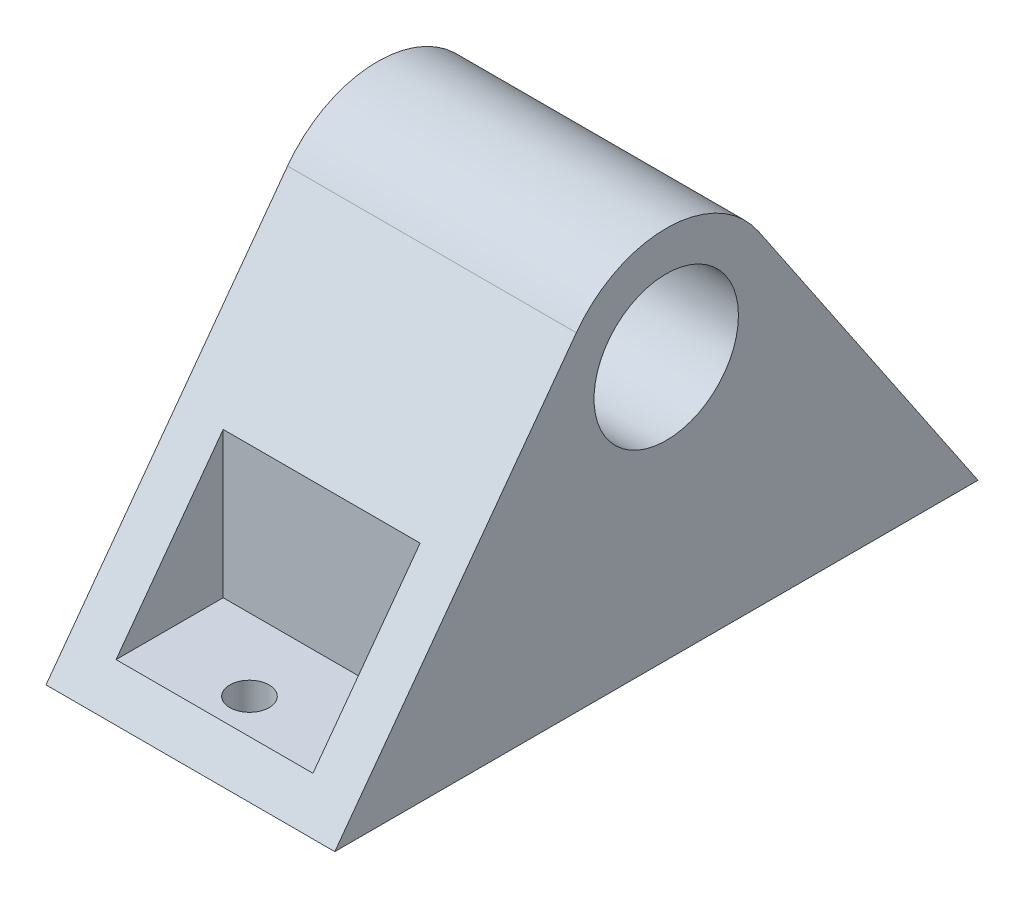
ISO-10303-21;
HEADER;
FILE_DESCRIPTION(('STEP AP214'),'2;1');
FILE_NAME('part.step','',(''),(''),'','','');
FILE_SCHEMA(('AUTOMOTIVE_DESIGN { 1 0 10303 214 1 1 1 1 }'));
ENDSEC;
DATA;
#1=APPLICATION_CONTEXT('core data for automotive mechanical design processes');
#2=APPLICATION_PROTOCOL_DEFINITION('international standard','automotive_design',2000,#1);
#3=PRODUCT_CONTEXT('',#1,'mechanical');
#4=PRODUCT('Part','Part','',(#3));
#5=PRODUCT_RELATED_PRODUCT_CATEGORY('part','',(#4));
#6=PRODUCT_DEFINITION_FORMATION('','',#4);
#7=PRODUCT_DEFINITION_CONTEXT('part definition',#1,'design');
#8=PRODUCT_DEFINITION('design','',#6,#7);
#9=PRODUCT_DEFINITION_SHAPE('','',#8);
#10=(LENGTH_UNIT() NAMED_UNIT(*) SI_UNIT(.MILLI.,.METRE.));
#11=(NAMED_UNIT(*) PLANE_ANGLE_UNIT() SI_UNIT($,.RADIAN.));
#12=(NAMED_UNIT(*) SI_UNIT($,.STERADIAN.) SOLID_ANGLE_UNIT());
#13=UNCERTAINTY_MEASURE_WITH_UNIT(LENGTH_MEASURE(1.E-05),#10,'distance_accuracy_value','');
#14=(GEOMETRIC_REPRESENTATION_CONTEXT(3) GLOBAL_UNCERTAINTY_ASSIGNED_CONTEXT((#13)) GLOBAL_UNIT_ASSIGNED_CONTEXT((#10,
#11,#12)) REPRESENTATION_CONTEXT('',''));
#15=CARTESIAN_POINT('',(0.,0.,0.));
#16=DIRECTION('',(0.,0.,1.));
#17=DIRECTION('',(1.,0.,0.));
#18=AXIS2_PLACEMENT_3D('',#15,#16,#17);
#19=CARTESIAN_POINT('',(22.,11.6916646054975,15.9061562811997));
#20=DIRECTION('',(0.,-0.592257656243972,-0.805748638609087));
#21=DIRECTION('',(0.,0.805748638609087,-0.592257656243972));
#22=AXIS2_PLACEMENT_3D('',#19,#20,#21);
#23=PLANE('',#22);
#24=DIRECTION('',(-1.,0.,0.));
#25=VECTOR('',#24,1.);
#26=CARTESIAN_POINT('',(22.,2.49999999999999,22.6623994510672));
#27=LINE('',#26,#25);
#28=CARTESIAN_POINT('',(18.5,2.49999999999999,22.6623994510672));
#29=VERTEX_POINT('',#28);
#30=CARTESIAN_POINT('',(3.5,2.49999999999999,22.6623994510672));
#31=VERTEX_POINT('',#30);
#32=EDGE_CURVE('E227',#29,#31,#27,.T.);
#33=ORIENTED_EDGE('',*,*,#32,.T.);
#34=DIRECTION('',(0.,0.805748638609087,-0.592257656243972));
#35=VECTOR('',#34,1.);
#36=CARTESIAN_POINT('',(3.5,11.6916646054975,15.9061562811997));
#37=LINE('',#36,#35);
#38=CARTESIAN_POINT('',(3.5,13.6046977209049,14.5));
#39=VERTEX_POINT('',#38);
#40=EDGE_CURVE('E12',#31,#39,#37,.T.);
#41=ORIENTED_EDGE('',*,*,#40,.T.);
#42=DIRECTION('',(1.,0.,0.));
#43=VECTOR('',#42,1.);
#44=CARTESIAN_POINT('',(22.,13.6046977209049,14.5));
#45=LINE('',#44,#43);
#46=CARTESIAN_POINT('',(18.5,13.6046977209049,14.5));
#47=VERTEX_POINT('',#46);
#48=EDGE_CURVE('E79',#39,#47,#45,.T.);
#49=ORIENTED_EDGE('',*,*,#48,.T.);
#50=DIRECTION('',(0.,-0.805748638609087,0.592257656243972));
#51=VECTOR('',#50,1.);
#52=CARTESIAN_POINT('',(18.5,11.6916646054975,15.9061562811997));
#53=LINE('',#52,#51);
#54=EDGE_CURVE('E230',#47,#29,#53,.T.);
#55=ORIENTED_EDGE('',*,*,#54,.T.);
#56=EDGE_LOOP('',(#33,#41,#49,#55));
#57=FACE_BOUND('',#56,.T.);
#58=DIRECTION('',(0.,-0.805748638609087,0.592257656243972));
#59=VECTOR('',#58,1.);
#60=CARTESIAN_POINT('',(0.,11.6916646054975,15.9061562811997));
#61=LINE('',#60,#59);
#62=CARTESIAN_POINT('',(0.,25.0341900780738,6.09886342817725));
#63=VERTEX_POINT('',#62);
#64=CARTESIAN_POINT('',(0.,0.,24.5));
#65=VERTEX_POINT('',#64);
#66=EDGE_CURVE('E195',#63,#65,#61,.T.);
#67=ORIENTED_EDGE('',*,*,#66,.T.);
#68=DIRECTION('',(-1.,0.,0.));
#69=VECTOR('',#68,1.);
#70=CARTESIAN_POINT('',(22.,0.,24.5));
#71=LINE('',#70,#69);
#72=CARTESIAN_POINT('',(22.,0.,24.5));
#73=VERTEX_POINT('',#72);
#74=EDGE_CURVE('E206',#73,#65,#71,.T.);
#75=ORIENTED_EDGE('',*,*,#74,.F.);
#76=DIRECTION('',(0.,-0.805748638609087,0.592257656243972));
#77=VECTOR('',#76,1.);
#78=CARTESIAN_POINT('',(22.,11.6916646054975,15.9061562811997));
#79=LINE('',#78,#77);
#80=CARTESIAN_POINT('',(22.,25.0341900780738,6.09886342817725));
#81=VERTEX_POINT('',#80);
#82=EDGE_CURVE('E186',#81,#73,#79,.T.);
#83=ORIENTED_EDGE('',*,*,#82,.F.);
#84=DIRECTION('',(-1.,0.,0.));
#85=VECTOR('',#84,1.);
#86=CARTESIAN_POINT('',(22.,25.0341900780738,6.09886342817725));
#87=LINE('',#86,#85);
#88=EDGE_CURVE('E209',#81,#63,#87,.T.);
#89=ORIENTED_EDGE('',*,*,#88,.T.);
#90=EDGE_LOOP('',(#67,#75,#83,#89));
#91=FACE_BOUND('',#90,.T.);
#92=ADVANCED_FACE('F70',(#57,#91),#23,.F.);
#93=CARTESIAN_POINT('',(22.,0.,0.));
#94=DIRECTION('',(0.,1.,0.));
#95=DIRECTION('',(0.,0.,1.));
#96=AXIS2_PLACEMENT_3D('',#93,#94,#95);
#97=PLANE('',#96);
#98=CARTESIAN_POINT('',(11.,0.,-20.));
#99=DIRECTION('',(0.,1.,0.));
#100=DIRECTION('',(0.,0.,1.));
#101=AXIS2_PLACEMENT_3D('',#98,#99,#100);
#102=CIRCLE('',#101,1.5);
#103=CARTESIAN_POINT('',(11.,0.,-18.5));
#104=VERTEX_POINT('',#103);
#105=EDGE_CURVE('E236',#104,#104,#102,.T.);
#106=ORIENTED_EDGE('',*,*,#105,.T.);
#107=EDGE_LOOP('',(#106));
#108=FACE_BOUND('',#107,.T.);
#109=CARTESIAN_POINT('',(11.,0.,20.));
#110=DIRECTION('',(0.,1.,0.));
#111=DIRECTION('',(0.,0.,1.));
#112=AXIS2_PLACEMENT_3D('',#109,#110,#111);
#113=CIRCLE('',#112,1.5);
#114=CARTESIAN_POINT('',(11.,0.,21.5));
#115=VERTEX_POINT('',#114);
#116=EDGE_CURVE('E241',#115,#115,#113,.T.);
#117=ORIENTED_EDGE('',*,*,#116,.T.);
#118=EDGE_LOOP('',(#117));
#119=FACE_BOUND('',#118,.T.);
#120=DIRECTION('',(0.,0.,-1.));
#121=VECTOR('',#120,1.);
#122=CARTESIAN_POINT('',(0.,0.,0.));
#123=LINE('',#122,#121);
#124=CARTESIAN_POINT('',(0.,0.,-24.5));
#125=VERTEX_POINT('',#124);
#126=EDGE_CURVE('E197',#65,#125,#123,.T.);
#127=ORIENTED_EDGE('',*,*,#126,.T.);
#128=DIRECTION('',(-1.,0.,0.));
#129=VECTOR('',#128,1.);
#130=CARTESIAN_POINT('',(22.,0.,-24.5));
#131=LINE('',#130,#129);
#132=CARTESIAN_POINT('',(22.,0.,-24.5));
#133=VERTEX_POINT('',#132);
#134=EDGE_CURVE('E204',#133,#125,#131,.T.);
#135=ORIENTED_EDGE('',*,*,#134,.F.);
#136=DIRECTION('',(0.,0.,-1.));
#137=VECTOR('',#136,1.);
#138=CARTESIAN_POINT('',(22.,0.,0.));
#139=LINE('',#138,#137);
#140=EDGE_CURVE('E188',#73,#133,#139,.T.);
#141=ORIENTED_EDGE('',*,*,#140,.F.);
#142=ORIENTED_EDGE('',*,*,#74,.T.);
#143=EDGE_LOOP('',(#127,#135,#141,#142));
#144=FACE_BOUND('',#143,.T.);
#145=ADVANCED_FACE('F248',(#108,#119,#144),#97,.F.);
#146=CARTESIAN_POINT('',(22.,11.3597790965813,-16.8345303878232));
#147=DIRECTION('',(0.,0.559353475631549,-0.828929242637094));
#148=DIRECTION('',(0.,0.828929242637094,0.559353475631549));
#149=AXIS2_PLACEMENT_3D('',#146,#147,#148);
#150=PLANE('',#149);
#151=DIRECTION('',(1.,0.,0.));
#152=VECTOR('',#151,1.);
#153=CARTESIAN_POINT('',(22.,14.8194170368062,-14.5));
#154=LINE('',#153,#152);
#155=CARTESIAN_POINT('',(3.5,14.8194170368062,-14.5));
#156=VERTEX_POINT('',#155);
#157=CARTESIAN_POINT('',(18.5,14.8194170368062,-14.5));
#158=VERTEX_POINT('',#157);
#159=EDGE_CURVE('E225',#156,#158,#154,.T.);
#160=ORIENTED_EDGE('',*,*,#159,.F.);
#161=DIRECTION('',(0.,0.828929242637094,0.559353475631549));
#162=VECTOR('',#161,1.);
#163=CARTESIAN_POINT('',(3.5,11.3597790965813,-16.8345303878232));
#164=LINE('',#163,#162);
#165=CARTESIAN_POINT('',(3.5,2.49999999999999,-22.8130240590498));
#166=VERTEX_POINT('',#165);
#167=EDGE_CURVE('E163',#166,#156,#164,.T.);
#168=ORIENTED_EDGE('',*,*,#167,.F.);
#169=DIRECTION('',(1.,0.,0.));
#170=VECTOR('',#169,1.);
#171=CARTESIAN_POINT('',(22.,2.49999999999999,-22.8130240590498));
#172=LINE('',#171,#170);
#173=CARTESIAN_POINT('',(18.5,2.49999999999999,-22.8130240590498));
#174=VERTEX_POINT('',#173);
#175=EDGE_CURVE('E155',#166,#174,#172,.T.);
#176=ORIENTED_EDGE('',*,*,#175,.T.);
#177=DIRECTION('',(0.,-0.828929242637094,-0.559353475631549));
#178=VECTOR('',#177,1.);
#179=CARTESIAN_POINT('',(18.5,11.3597790965813,-16.8345303878232));
#180=LINE('',#179,#178);
#181=EDGE_CURVE('E222',#158,#174,#180,.T.);
#182=ORIENTED_EDGE('',*,*,#181,.F.);
#183=EDGE_LOOP('',(#160,#168,#176,#182));
#184=FACE_BOUND('',#183,.T.);
#185=DIRECTION('',(0.,-0.828929242637094,-0.559353475631549));
#186=VECTOR('',#185,1.);
#187=CARTESIAN_POINT('',(0.,11.3597790965813,-16.8345303878232));
#188=LINE('',#187,#186);
#189=CARTESIAN_POINT('',(0.,24.7545045428682,-7.7958985624153));
#190=VERTEX_POINT('',#189);
#191=EDGE_CURVE('E189',#190,#125,#188,.T.);
#192=ORIENTED_EDGE('',*,*,#191,.F.);
#193=DIRECTION('',(-1.,0.,0.));
#194=VECTOR('',#193,1.);
#195=CARTESIAN_POINT('',(22.,24.7545045428682,-7.7958985624153));
#196=LINE('',#195,#194);
#197=CARTESIAN_POINT('',(22.,24.7545045428682,-7.7958985624153));
#198=VERTEX_POINT('',#197);
#199=EDGE_CURVE('E194',#198,#190,#196,.T.);
#200=ORIENTED_EDGE('',*,*,#199,.F.);
#201=DIRECTION('',(0.,-0.828929242637094,-0.559353475631549));
#202=VECTOR('',#201,1.);
#203=CARTESIAN_POINT('',(22.,11.3597790965813,-16.8345303878232));
#204=LINE('',#203,#202);
#205=EDGE_CURVE('E191',#198,#133,#204,.T.);
#206=ORIENTED_EDGE('',*,*,#205,.T.);
#207=ORIENTED_EDGE('',*,*,#134,.T.);
#208=EDGE_LOOP('',(#192,#200,#206,#207));
#209=FACE_BOUND('',#208,.T.);
#210=ADVANCED_FACE('F272',(#184,#209),#150,.T.);
#211=CARTESIAN_POINT('',(0.,0.,0.));
#212=DIRECTION('',(1.,0.,0.));
#213=DIRECTION('',(0.,0.,-1.));
#214=AXIS2_PLACEMENT_3D('',#211,#212,#213);
#215=PLANE('',#214);
#216=ORIENTED_EDGE('',*,*,#66,.F.);
#217=CARTESIAN_POINT('',(0.,20.,-0.749999999999998));
#218=DIRECTION('',(1.,0.,0.));
#219=DIRECTION('',(0.,0.,-1.));
#220=AXIS2_PLACEMENT_3D('',#217,#218,#219);
#221=CIRCLE('',#220,8.5);
#222=EDGE_CURVE('E214',#190,#63,#221,.T.);
#223=ORIENTED_EDGE('',*,*,#222,.F.);
#224=ORIENTED_EDGE('',*,*,#191,.T.);
#225=ORIENTED_EDGE('',*,*,#126,.F.);
#226=EDGE_LOOP('',(#216,#223,#224,#225));
#227=FACE_BOUND('',#226,.T.);
#228=CARTESIAN_POINT('',(0.,20.,-0.749999999999998));
#229=DIRECTION('',(1.,0.,0.));
#230=DIRECTION('',(0.,0.,-1.));
#231=AXIS2_PLACEMENT_3D('',#228,#229,#230);
#232=CIRCLE('',#231,5.5);
#233=CARTESIAN_POINT('',(0.,20.,-6.25));
#234=VERTEX_POINT('',#233);
#235=EDGE_CURVE('E174',#234,#234,#232,.T.);
#236=ORIENTED_EDGE('',*,*,#235,.T.);
#237=EDGE_LOOP('',(#236));
#238=FACE_BOUND('',#237,.T.);
#239=ADVANCED_FACE('F285',(#227,#238),#215,.F.);
#240=CARTESIAN_POINT('',(22.,0.,0.));
#241=DIRECTION('',(1.,0.,0.));
#242=DIRECTION('',(0.,0.,-1.));
#243=AXIS2_PLACEMENT_3D('',#240,#241,#242);
#244=PLANE('',#243);
#245=ORIENTED_EDGE('',*,*,#205,.F.);
#246=CARTESIAN_POINT('',(22.,20.,-0.749999999999998));
#247=DIRECTION('',(1.,0.,0.));
#248=DIRECTION('',(0.,0.,-1.));
#249=AXIS2_PLACEMENT_3D('',#246,#247,#248);
#250=CIRCLE('',#249,8.5);
#251=EDGE_CURVE('E198',#198,#81,#250,.T.);
#252=ORIENTED_EDGE('',*,*,#251,.T.);
#253=ORIENTED_EDGE('',*,*,#82,.T.);
#254=ORIENTED_EDGE('',*,*,#140,.T.);
#255=EDGE_LOOP('',(#245,#252,#253,#254));
#256=FACE_BOUND('',#255,.T.);
#257=CARTESIAN_POINT('',(22.,20.,-0.749999999999998));
#258=DIRECTION('',(1.,0.,0.));
#259=DIRECTION('',(0.,0.,-1.));
#260=AXIS2_PLACEMENT_3D('',#257,#258,#259);
#261=CIRCLE('',#260,5.5);
#262=CARTESIAN_POINT('',(22.,20.,-6.25));
#263=VERTEX_POINT('',#262);
#264=EDGE_CURVE('E211',#263,#263,#261,.T.);
#265=ORIENTED_EDGE('',*,*,#264,.F.);
#266=EDGE_LOOP('',(#265));
#267=FACE_BOUND('',#266,.T.);
#268=ADVANCED_FACE('F278',(#256,#267),#244,.T.);
#269=CARTESIAN_POINT('',(22.,20.,-0.749999999999998));
#270=DIRECTION('',(-1.,0.,0.));
#271=DIRECTION('',(0.,0.,1.));
#272=AXIS2_PLACEMENT_3D('',#269,#270,#271);
#273=CYLINDRICAL_SURFACE('',#272,5.5);
#274=ORIENTED_EDGE('',*,*,#264,.T.);
#275=EDGE_LOOP('',(#274));
#276=FACE_BOUND('',#275,.T.);
#277=ORIENTED_EDGE('',*,*,#235,.F.);
#278=EDGE_LOOP('',(#277));
#279=FACE_BOUND('',#278,.T.);
#280=ADVANCED_FACE('F276',(#276,#279),#273,.F.);
#281=CARTESIAN_POINT('',(22.,20.,-0.749999999999998));
#282=DIRECTION('',(-1.,0.,0.));
#283=DIRECTION('',(0.,0.,1.));
#284=AXIS2_PLACEMENT_3D('',#281,#282,#283);
#285=CYLINDRICAL_SURFACE('',#284,8.5);
#286=ORIENTED_EDGE('',*,*,#222,.T.);
#287=ORIENTED_EDGE('',*,*,#88,.F.);
#288=ORIENTED_EDGE('',*,*,#251,.F.);
#289=ORIENTED_EDGE('',*,*,#199,.T.);
#290=EDGE_LOOP('',(#286,#287,#288,#289));
#291=FACE_BOUND('',#290,.T.);
#292=ADVANCED_FACE('F72',(#291),#285,.T.);
#293=CARTESIAN_POINT('',(3.5,2.49999999999999,-24.5));
#294=DIRECTION('',(-1.,0.,0.));
#295=DIRECTION('',(0.,0.,1.));
#296=AXIS2_PLACEMENT_3D('',#293,#294,#295);
#297=PLANE('',#296);
#298=ORIENTED_EDGE('',*,*,#167,.T.);
#299=DIRECTION('',(0.,1.,0.));
#300=VECTOR('',#299,1.);
#301=CARTESIAN_POINT('',(3.5,2.49999999999999,-14.5));
#302=LINE('',#301,#300);
#303=CARTESIAN_POINT('',(3.5,2.49999999999999,-14.5));
#304=VERTEX_POINT('',#303);
#305=EDGE_CURVE('E161',#304,#156,#302,.T.);
#306=ORIENTED_EDGE('',*,*,#305,.F.);
#307=DIRECTION('',(0.,0.,1.));
#308=VECTOR('',#307,1.);
#309=CARTESIAN_POINT('',(3.5,2.49999999999999,-24.5));
#310=LINE('',#309,#308);
#311=EDGE_CURVE('E149',#166,#304,#310,.T.);
#312=ORIENTED_EDGE('',*,*,#311,.F.);
#313=EDGE_LOOP('',(#298,#306,#312));
#314=FACE_BOUND('',#313,.T.);
#315=ADVANCED_FACE('F162',(#314),#297,.F.);
#316=CARTESIAN_POINT('',(18.5,2.49999999999999,-24.5));
#317=DIRECTION('',(1.,0.,0.));
#318=DIRECTION('',(0.,0.,-1.));
#319=AXIS2_PLACEMENT_3D('',#316,#317,#318);
#320=PLANE('',#319);
#321=ORIENTED_EDGE('',*,*,#181,.T.);
#322=DIRECTION('',(0.,0.,-1.));
#323=VECTOR('',#322,1.);
#324=CARTESIAN_POINT('',(18.5,2.49999999999999,-24.5));
#325=LINE('',#324,#323);
#326=CARTESIAN_POINT('',(18.5,2.49999999999999,-14.5));
#327=VERTEX_POINT('',#326);
#328=EDGE_CURVE('E95',#327,#174,#325,.T.);
#329=ORIENTED_EDGE('',*,*,#328,.F.);
#330=DIRECTION('',(0.,1.,0.));
#331=VECTOR('',#330,1.);
#332=CARTESIAN_POINT('',(18.5,2.49999999999999,-14.5));
#333=LINE('',#332,#331);
#334=EDGE_CURVE('E166',#327,#158,#333,.T.);
#335=ORIENTED_EDGE('',*,*,#334,.T.);
#336=EDGE_LOOP('',(#321,#329,#335));
#337=FACE_BOUND('',#336,.T.);
#338=ADVANCED_FACE('F290',(#337),#320,.F.);
#339=CARTESIAN_POINT('',(3.5,2.49999999999999,-14.5));
#340=DIRECTION('',(0.,0.,1.));
#341=DIRECTION('',(1.,0.,0.));
#342=AXIS2_PLACEMENT_3D('',#339,#340,#341);
#343=PLANE('',#342);
#344=ORIENTED_EDGE('',*,*,#159,.T.);
#345=ORIENTED_EDGE('',*,*,#334,.F.);
#346=DIRECTION('',(1.,0.,0.));
#347=VECTOR('',#346,1.);
#348=CARTESIAN_POINT('',(3.5,2.49999999999999,-14.5));
#349=LINE('',#348,#347);
#350=EDGE_CURVE('E153',#304,#327,#349,.T.);
#351=ORIENTED_EDGE('',*,*,#350,.F.);
#352=ORIENTED_EDGE('',*,*,#305,.T.);
#353=EDGE_LOOP('',(#344,#345,#351,#352));
#354=FACE_BOUND('',#353,.T.);
#355=ADVANCED_FACE('F168',(#354),#343,.F.);
#356=CARTESIAN_POINT('',(0.,2.49999999999999,0.));
#357=DIRECTION('',(0.,1.,0.));
#358=DIRECTION('',(0.,0.,1.));
#359=AXIS2_PLACEMENT_3D('',#356,#357,#358);
#360=PLANE('',#359);
#361=CARTESIAN_POINT('',(11.,2.49999999999999,-20.));
#362=DIRECTION('',(0.,1.,0.));
#363=DIRECTION('',(0.,0.,1.));
#364=AXIS2_PLACEMENT_3D('',#361,#362,#363);
#365=CIRCLE('',#364,1.5);
#366=CARTESIAN_POINT('',(11.,2.49999999999999,-18.5));
#367=VERTEX_POINT('',#366);
#368=EDGE_CURVE('E74',#367,#367,#365,.T.);
#369=ORIENTED_EDGE('',*,*,#368,.F.);
#370=EDGE_LOOP('',(#369));
#371=FACE_BOUND('',#370,.T.);
#372=ORIENTED_EDGE('',*,*,#311,.T.);
#373=ORIENTED_EDGE('',*,*,#350,.T.);
#374=ORIENTED_EDGE('',*,*,#328,.T.);
#375=ORIENTED_EDGE('',*,*,#175,.F.);
#376=EDGE_LOOP('',(#372,#373,#374,#375));
#377=FACE_BOUND('',#376,.T.);
#378=ADVANCED_FACE('F151',(#371,#377),#360,.T.);
#379=CARTESIAN_POINT('',(3.5,2.49999999999999,24.5));
#380=DIRECTION('',(-1.,0.,0.));
#381=DIRECTION('',(0.,0.,1.));
#382=AXIS2_PLACEMENT_3D('',#379,#380,#381);
#383=PLANE('',#382);
#384=DIRECTION('',(0.,0.,1.));
#385=VECTOR('',#384,1.);
#386=CARTESIAN_POINT('',(3.5,2.49999999999999,24.5));
#387=LINE('',#386,#385);
#388=CARTESIAN_POINT('',(3.5,2.49999999999999,14.5));
#389=VERTEX_POINT('',#388);
#390=EDGE_CURVE('E87',#389,#31,#387,.T.);
#391=ORIENTED_EDGE('',*,*,#390,.F.);
#392=DIRECTION('',(0.,1.,0.));
#393=VECTOR('',#392,1.);
#394=CARTESIAN_POINT('',(3.5,2.49999999999999,14.5));
#395=LINE('',#394,#393);
#396=EDGE_CURVE('E158',#389,#39,#395,.T.);
#397=ORIENTED_EDGE('',*,*,#396,.T.);
#398=ORIENTED_EDGE('',*,*,#40,.F.);
#399=EDGE_LOOP('',(#391,#397,#398));
#400=FACE_BOUND('',#399,.T.);
#401=ADVANCED_FACE('F302',(#400),#383,.F.);
#402=CARTESIAN_POINT('',(3.5,2.49999999999999,14.5));
#403=DIRECTION('',(0.,0.,-1.));
#404=DIRECTION('',(-1.,0.,0.));
#405=AXIS2_PLACEMENT_3D('',#402,#403,#404);
#406=PLANE('',#405);
#407=ORIENTED_EDGE('',*,*,#396,.F.);
#408=DIRECTION('',(-1.,0.,0.));
#409=VECTOR('',#408,1.);
#410=CARTESIAN_POINT('',(3.5,2.49999999999999,14.5));
#411=LINE('',#410,#409);
#412=CARTESIAN_POINT('',(18.5,2.49999999999999,14.5));
#413=VERTEX_POINT('',#412);
#414=EDGE_CURVE('E179',#413,#389,#411,.T.);
#415=ORIENTED_EDGE('',*,*,#414,.F.);
#416=DIRECTION('',(0.,1.,0.));
#417=VECTOR('',#416,1.);
#418=CARTESIAN_POINT('',(18.5,2.49999999999999,14.5));
#419=LINE('',#418,#417);
#420=EDGE_CURVE('E181',#413,#47,#419,.T.);
#421=ORIENTED_EDGE('',*,*,#420,.T.);
#422=ORIENTED_EDGE('',*,*,#48,.F.);
#423=EDGE_LOOP('',(#407,#415,#421,#422));
#424=FACE_BOUND('',#423,.T.);
#425=ADVANCED_FACE('F299',(#424),#406,.F.);
#426=CARTESIAN_POINT('',(18.5,2.49999999999999,24.5));
#427=DIRECTION('',(1.,0.,0.));
#428=DIRECTION('',(0.,0.,-1.));
#429=AXIS2_PLACEMENT_3D('',#426,#427,#428);
#430=PLANE('',#429);
#431=ORIENTED_EDGE('',*,*,#420,.F.);
#432=DIRECTION('',(0.,0.,-1.));
#433=VECTOR('',#432,1.);
#434=CARTESIAN_POINT('',(18.5,2.49999999999999,24.5));
#435=LINE('',#434,#433);
#436=EDGE_CURVE('E177',#29,#413,#435,.T.);
#437=ORIENTED_EDGE('',*,*,#436,.F.);
#438=ORIENTED_EDGE('',*,*,#54,.F.);
#439=EDGE_LOOP('',(#431,#437,#438));
#440=FACE_BOUND('',#439,.T.);
#441=ADVANCED_FACE('F263',(#440),#430,.F.);
#442=CARTESIAN_POINT('',(0.,2.49999999999999,0.));
#443=DIRECTION('',(0.,-1.,0.));
#444=DIRECTION('',(0.,0.,-1.));
#445=AXIS2_PLACEMENT_3D('',#442,#443,#444);
#446=PLANE('',#445);
#447=CARTESIAN_POINT('',(11.,2.49999999999999,20.));
#448=DIRECTION('',(0.,-1.,0.));
#449=DIRECTION('',(0.,0.,-1.));
#450=AXIS2_PLACEMENT_3D('',#447,#448,#449);
#451=CIRCLE('',#450,1.5);
#452=CARTESIAN_POINT('',(11.,2.49999999999999,21.5));
#453=VERTEX_POINT('',#452);
#454=EDGE_CURVE('E234',#453,#453,#451,.T.);
#455=ORIENTED_EDGE('',*,*,#454,.T.);
#456=EDGE_LOOP('',(#455));
#457=FACE_BOUND('',#456,.T.);
#458=ORIENTED_EDGE('',*,*,#436,.T.);
#459=ORIENTED_EDGE('',*,*,#414,.T.);
#460=ORIENTED_EDGE('',*,*,#390,.T.);
#461=ORIENTED_EDGE('',*,*,#32,.F.);
#462=EDGE_LOOP('',(#458,#459,#460,#461));
#463=FACE_BOUND('',#462,.T.);
#464=ADVANCED_FACE('F255',(#457,#463),#446,.F.);
#465=CARTESIAN_POINT('',(11.,0.,20.));
#466=DIRECTION('',(0.,1.,0.));
#467=DIRECTION('',(0.,0.,1.));
#468=AXIS2_PLACEMENT_3D('',#465,#466,#467);
#469=CYLINDRICAL_SURFACE('',#468,1.5);
#470=CARTESIAN_POINT('',(11.,0.,21.5));
#471=CARTESIAN_POINT('',(11.,0.0260416666666665,21.5));
#472=CARTESIAN_POINT('',(11.,0.0520833333333331,21.5));
#473=CARTESIAN_POINT('',(11.,0.104166666666666,21.5));
#474=CARTESIAN_POINT('',(11.,0.130208333333333,21.5));
#475=CARTESIAN_POINT('',(11.,0.182291666666666,21.5));
#476=CARTESIAN_POINT('',(11.,0.208333333333332,21.5));
#477=CARTESIAN_POINT('',(11.,0.260416666666666,21.5));
#478=CARTESIAN_POINT('',(11.,0.286458333333332,21.5));
#479=CARTESIAN_POINT('',(11.,0.338541666666665,21.5));
#480=CARTESIAN_POINT('',(11.,0.364583333333332,21.5));
#481=CARTESIAN_POINT('',(11.,0.416666666666665,21.5));
#482=CARTESIAN_POINT('',(11.,0.442708333333331,21.5));
#483=CARTESIAN_POINT('',(11.,0.494791666666664,21.5));
#484=CARTESIAN_POINT('',(11.,0.520833333333331,21.5));
#485=CARTESIAN_POINT('',(11.,0.572916666666664,21.5));
#486=CARTESIAN_POINT('',(11.,0.598958333333331,21.5));
#487=CARTESIAN_POINT('',(11.,0.651041666666664,21.5));
#488=CARTESIAN_POINT('',(11.,0.67708333333333,21.5));
#489=CARTESIAN_POINT('',(11.,0.729166666666663,21.5));
#490=CARTESIAN_POINT('',(11.,0.75520833333333,21.5));
#491=CARTESIAN_POINT('',(11.,0.807291666666663,21.5));
#492=CARTESIAN_POINT('',(11.,0.83333333333333,21.5));
#493=CARTESIAN_POINT('',(11.,0.885416666666663,21.5));
#494=CARTESIAN_POINT('',(11.,0.911458333333329,21.5));
#495=CARTESIAN_POINT('',(11.,0.963541666666662,21.5));
#496=CARTESIAN_POINT('',(11.,0.989583333333329,21.5));
#497=CARTESIAN_POINT('',(11.,1.04166666666666,21.5));
#498=CARTESIAN_POINT('',(11.,1.06770833333333,21.5));
#499=CARTESIAN_POINT('',(11.,1.11979166666666,21.5));
#500=CARTESIAN_POINT('',(11.,1.14583333333333,21.5));
#501=CARTESIAN_POINT('',(11.,1.19791666666666,21.5));
#502=CARTESIAN_POINT('',(11.,1.22395833333333,21.5));
#503=CARTESIAN_POINT('',(11.,1.27604166666666,21.5));
#504=CARTESIAN_POINT('',(11.,1.30208333333333,21.5));
#505=CARTESIAN_POINT('',(11.,1.35416666666666,21.5));
#506=CARTESIAN_POINT('',(11.,1.38020833333333,21.5));
#507=CARTESIAN_POINT('',(11.,1.43229166666666,21.5));
#508=CARTESIAN_POINT('',(11.,1.45833333333333,21.5));
#509=CARTESIAN_POINT('',(11.,1.51041666666666,21.5));
#510=CARTESIAN_POINT('',(11.,1.53645833333333,21.5));
#511=CARTESIAN_POINT('',(11.,1.58854166666666,21.5));
#512=CARTESIAN_POINT('',(11.,1.61458333333333,21.5));
#513=CARTESIAN_POINT('',(11.,1.66666666666666,21.5));
#514=CARTESIAN_POINT('',(11.,1.69270833333333,21.5));
#515=CARTESIAN_POINT('',(11.,1.74479166666666,21.5));
#516=CARTESIAN_POINT('',(11.,1.77083333333333,21.5));
#517=CARTESIAN_POINT('',(11.,1.82291666666666,21.5));
#518=CARTESIAN_POINT('',(11.,1.84895833333333,21.5));
#519=CARTESIAN_POINT('',(11.,1.90104166666666,21.5));
#520=CARTESIAN_POINT('',(11.,1.92708333333332,21.5));
#521=CARTESIAN_POINT('',(11.,1.97916666666666,21.5));
#522=CARTESIAN_POINT('',(11.,2.00520833333332,21.5));
#523=CARTESIAN_POINT('',(11.,2.05729166666666,21.5));
#524=CARTESIAN_POINT('',(11.,2.08333333333332,21.5));
#525=CARTESIAN_POINT('',(11.,2.13541666666666,21.5));
#526=CARTESIAN_POINT('',(11.,2.16145833333332,21.5));
#527=CARTESIAN_POINT('',(11.,2.21354166666666,21.5));
#528=CARTESIAN_POINT('',(11.,2.23958333333332,21.5));
#529=CARTESIAN_POINT('',(11.,2.29166666666666,21.5));
#530=CARTESIAN_POINT('',(11.,2.31770833333332,21.5));
#531=CARTESIAN_POINT('',(11.,2.36979166666666,21.5));
#532=CARTESIAN_POINT('',(11.,2.39583333333332,21.5));
#533=CARTESIAN_POINT('',(11.,2.44791666666666,21.5));
#534=CARTESIAN_POINT('',(11.,2.47395833333332,21.5));
#535=CARTESIAN_POINT('',(11.,2.49999999999999,21.5));
#536=B_SPLINE_CURVE_WITH_KNOTS('',3,(#470,#471,#472,#473,#474,#475,#476,#477,#478,#479,#480,
#481,#482,#483,#484,#485,#486,#487,#488,#489,#490,#491,#492,#493,#494,#495,#496,#497,#498,#499,
#500,#501,#502,#503,#504,#505,#506,#507,#508,#509,#510,#511,#512,#513,#514,#515,#516,#517,#518,
#519,#520,#521,#522,#523,#524,#525,#526,#527,#528,#529,#530,#531,#532,#533,#534,#535),
.UNSPECIFIED.,.F.,.F.,(4,2,2,2,2,2,2,2,2,2,2,2,2,2,2,2,2,2,2,2,2,2,2,2,2,2,2,2,2,2,2,2,4),(0.,
0.0781249999999997,0.156249999999999,0.234374999999999,0.312499999999999,0.390624999999998,
0.468749999999998,0.546874999999998,0.624999999999997,0.703124999999997,0.781249999999996,
0.859374999999996,0.937499999999996,1.015625,1.09375,1.17187499999999,1.24999999999999,
1.32812499999999,1.40624999999999,1.48437499999999,1.56249999999999,1.64062499999999,
1.71874999999999,1.79687499999999,1.87499999999999,1.95312499999999,2.03124999999999,
2.10937499999999,2.18749999999999,2.26562499999999,2.34374999999999,2.42187499999999,
2.49999999999999),.UNSPECIFIED.);
#537=EDGE_CURVE('BSEAM251',#115,#453,#536,.T.);
#538=ORIENTED_EDGE('',*,*,#116,.F.);
#539=ORIENTED_EDGE('',*,*,#454,.F.);
#540=ORIENTED_EDGE('',*,*,#537,.T.);
#541=ORIENTED_EDGE('',*,*,#537,.F.);
#542=EDGE_LOOP('',(#538,#540,#539,#541));
#543=FACE_BOUND('',#542,.T.);
#544=ADVANCED_FACE('F251',(#543),#469,.F.);
#545=CARTESIAN_POINT('',(11.,0.,-20.));
#546=DIRECTION('',(0.,1.,0.));
#547=DIRECTION('',(0.,0.,1.));
#548=AXIS2_PLACEMENT_3D('',#545,#546,#547);
#549=CYLINDRICAL_SURFACE('',#548,1.5);
#550=CARTESIAN_POINT('',(11.,2.49999999999999,-18.5));
#551=CARTESIAN_POINT('',(11.,2.47395833333332,-18.5));
#552=CARTESIAN_POINT('',(11.,2.44791666666665,-18.5));
#553=CARTESIAN_POINT('',(11.,2.39583333333332,-18.5));
#554=CARTESIAN_POINT('',(11.,2.36979166666665,-18.5));
#555=CARTESIAN_POINT('',(11.,2.31770833333332,-18.5));
#556=CARTESIAN_POINT('',(11.,2.29166666666666,-18.5));
#557=CARTESIAN_POINT('',(11.,2.23958333333332,-18.5));
#558=CARTESIAN_POINT('',(11.,2.21354166666666,-18.5));
#559=CARTESIAN_POINT('',(11.,2.16145833333332,-18.5));
#560=CARTESIAN_POINT('',(11.,2.13541666666666,-18.5));
#561=CARTESIAN_POINT('',(11.,2.08333333333332,-18.5));
#562=CARTESIAN_POINT('',(11.,2.05729166666666,-18.5));
#563=CARTESIAN_POINT('',(11.,2.00520833333332,-18.5));
#564=CARTESIAN_POINT('',(11.,1.97916666666666,-18.5));
#565=CARTESIAN_POINT('',(11.,1.92708333333332,-18.5));
#566=CARTESIAN_POINT('',(11.,1.90104166666666,-18.5));
#567=CARTESIAN_POINT('',(11.,1.84895833333332,-18.5));
#568=CARTESIAN_POINT('',(11.,1.82291666666666,-18.5));
#569=CARTESIAN_POINT('',(11.,1.77083333333332,-18.5));
#570=CARTESIAN_POINT('',(11.,1.74479166666666,-18.5));
#571=CARTESIAN_POINT('',(11.,1.69270833333333,-18.5));
#572=CARTESIAN_POINT('',(11.,1.66666666666666,-18.5));
#573=CARTESIAN_POINT('',(11.,1.61458333333333,-18.5));
#574=CARTESIAN_POINT('',(11.,1.58854166666666,-18.5));
#575=CARTESIAN_POINT('',(11.,1.53645833333333,-18.5));
#576=CARTESIAN_POINT('',(11.,1.51041666666666,-18.5));
#577=CARTESIAN_POINT('',(11.,1.45833333333333,-18.5));
#578=CARTESIAN_POINT('',(11.,1.43229166666666,-18.5));
#579=CARTESIAN_POINT('',(11.,1.38020833333333,-18.5));
#580=CARTESIAN_POINT('',(11.,1.35416666666666,-18.5));
#581=CARTESIAN_POINT('',(11.,1.30208333333333,-18.5));
#582=CARTESIAN_POINT('',(11.,1.27604166666666,-18.5));
#583=CARTESIAN_POINT('',(11.,1.22395833333333,-18.5));
#584=CARTESIAN_POINT('',(11.,1.19791666666666,-18.5));
#585=CARTESIAN_POINT('',(11.,1.14583333333333,-18.5));
#586=CARTESIAN_POINT('',(11.,1.11979166666666,-18.5));
#587=CARTESIAN_POINT('',(11.,1.06770833333333,-18.5));
#588=CARTESIAN_POINT('',(11.,1.04166666666666,-18.5));
#589=CARTESIAN_POINT('',(11.,0.989583333333328,-18.5));
#590=CARTESIAN_POINT('',(11.,0.963541666666662,-18.5));
#591=CARTESIAN_POINT('',(11.,0.911458333333329,-18.5));
#592=CARTESIAN_POINT('',(11.,0.885416666666662,-18.5));
#593=CARTESIAN_POINT('',(11.,0.833333333333329,-18.5));
#594=CARTESIAN_POINT('',(11.,0.807291666666663,-18.5));
#595=CARTESIAN_POINT('',(11.,0.75520833333333,-18.5));
#596=CARTESIAN_POINT('',(11.,0.729166666666663,-18.5));
#597=CARTESIAN_POINT('',(11.,0.67708333333333,-18.5));
#598=CARTESIAN_POINT('',(11.,0.651041666666664,-18.5));
#599=CARTESIAN_POINT('',(11.,0.59895833333333,-18.5));
#600=CARTESIAN_POINT('',(11.,0.572916666666664,-18.5));
#601=CARTESIAN_POINT('',(11.,0.520833333333331,-18.5));
#602=CARTESIAN_POINT('',(11.,0.494791666666664,-18.5));
#603=CARTESIAN_POINT('',(11.,0.442708333333331,-18.5));
#604=CARTESIAN_POINT('',(11.,0.416666666666665,-18.5));
#605=CARTESIAN_POINT('',(11.,0.364583333333332,-18.5));
#606=CARTESIAN_POINT('',(11.,0.338541666666665,-18.5));
#607=CARTESIAN_POINT('',(11.,0.286458333333332,-18.5));
#608=CARTESIAN_POINT('',(11.,0.260416666666665,-18.5));
#609=CARTESIAN_POINT('',(11.,0.208333333333332,-18.5));
#610=CARTESIAN_POINT('',(11.,0.182291666666666,-18.5));
#611=CARTESIAN_POINT('',(11.,0.130208333333333,-18.5));
#612=CARTESIAN_POINT('',(11.,0.104166666666666,-18.5));
#613=CARTESIAN_POINT('',(11.,0.0520833333333331,-18.5));
#614=CARTESIAN_POINT('',(11.,0.0260416666666666,-18.5));
#615=CARTESIAN_POINT('',(11.,0.,-18.5));
#616=B_SPLINE_CURVE_WITH_KNOTS('',3,(#550,#551,#552,#553,#554,#555,#556,#557,#558,#559,#560,
#561,#562,#563,#564,#565,#566,#567,#568,#569,#570,#571,#572,#573,#574,#575,#576,#577,#578,#579,
#580,#581,#582,#583,#584,#585,#586,#587,#588,#589,#590,#591,#592,#593,#594,#595,#596,#597,#598,
#599,#600,#601,#602,#603,#604,#605,#606,#607,#608,#609,#610,#611,#612,#613,#614,#615),
.UNSPECIFIED.,.F.,.F.,(4,2,2,2,2,2,2,2,2,2,2,2,2,2,2,2,2,2,2,2,2,2,2,2,2,2,2,2,2,2,2,2,4),(0.,
0.0781249999999996,0.156249999999999,0.234374999999999,0.312499999999999,0.390624999999998,
0.468749999999998,0.546874999999997,0.624999999999997,0.703124999999997,0.781249999999996,
0.859374999999996,0.937499999999995,1.015625,1.09374999999999,1.17187499999999,1.24999999999999,
1.32812499999999,1.40624999999999,1.48437499999999,1.56249999999999,1.64062499999999,
1.71874999999999,1.79687499999999,1.87499999999999,1.95312499999999,2.03124999999999,
2.10937499999999,2.18749999999999,2.26562499999999,2.34374999999999,2.42187499999999,
2.49999999999999),.UNSPECIFIED.);
#617=EDGE_CURVE('BSEAM254',#367,#104,#616,.T.);
#618=ORIENTED_EDGE('',*,*,#368,.T.);
#619=ORIENTED_EDGE('',*,*,#105,.F.);
#620=ORIENTED_EDGE('',*,*,#617,.T.);
#621=ORIENTED_EDGE('',*,*,#617,.F.);
#622=EDGE_LOOP('',(#618,#620,#619,#621));
#623=FACE_BOUND('',#622,.T.);
#624=ADVANCED_FACE('F254',(#623),#549,.F.);
#625=CLOSED_SHELL('',(#92,#145,#210,#239,#268,#280,#292,#315,#338,#355,#378,#401,#425,#441,#464,
#544,#624));
#626=MANIFOLD_SOLID_BREP('B2',#625);
#627=ADVANCED_BREP_SHAPE_REPRESENTATION('',(#18,#626),#14);
#628=SHAPE_DEFINITION_REPRESENTATION(#9,#627);
ENDSEC;
END-ISO-10303-21;
